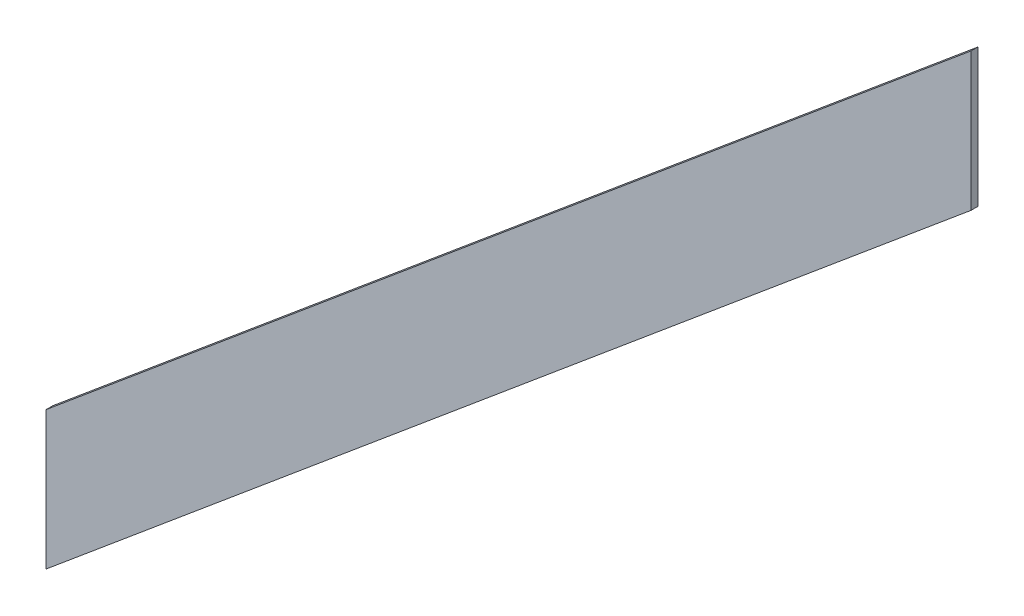
ISO-10303-21;
HEADER;
FILE_DESCRIPTION(('STEP AP214'),'2;1');
FILE_NAME('part.step','',(''),(''),'','','');
FILE_SCHEMA(('AUTOMOTIVE_DESIGN { 1 0 10303 214 1 1 1 1 }'));
ENDSEC;
DATA;
#1=APPLICATION_CONTEXT('core data for automotive mechanical design processes');
#2=APPLICATION_PROTOCOL_DEFINITION('international standard','automotive_design',2000,#1);
#3=PRODUCT_CONTEXT('',#1,'mechanical');
#4=PRODUCT('Part','Part','',(#3));
#5=PRODUCT_RELATED_PRODUCT_CATEGORY('part','',(#4));
#6=PRODUCT_DEFINITION_FORMATION('','',#4);
#7=PRODUCT_DEFINITION_CONTEXT('part definition',#1,'design');
#8=PRODUCT_DEFINITION('design','',#6,#7);
#9=PRODUCT_DEFINITION_SHAPE('','',#8);
#10=(LENGTH_UNIT() NAMED_UNIT(*) SI_UNIT(.MILLI.,.METRE.));
#11=(NAMED_UNIT(*) PLANE_ANGLE_UNIT() SI_UNIT($,.RADIAN.));
#12=(NAMED_UNIT(*) SI_UNIT($,.STERADIAN.) SOLID_ANGLE_UNIT());
#13=UNCERTAINTY_MEASURE_WITH_UNIT(LENGTH_MEASURE(1.E-05),#10,'distance_accuracy_value','');
#14=(GEOMETRIC_REPRESENTATION_CONTEXT(3) GLOBAL_UNCERTAINTY_ASSIGNED_CONTEXT((#13)) GLOBAL_UNIT_ASSIGNED_CONTEXT((#10,
#11,#12)) REPRESENTATION_CONTEXT('',''));
#15=CARTESIAN_POINT('',(0.,0.,0.));
#16=DIRECTION('',(0.,0.,1.));
#17=DIRECTION('',(1.,0.,0.));
#18=AXIS2_PLACEMENT_3D('',#15,#16,#17);
#19=CARTESIAN_POINT('',(3.54662453204845,-4.24328292227225,5.));
#20=DIRECTION('',(-0.641310134431533,0.767281767980583,0.));
#21=DIRECTION('',(-0.767281767980583,-0.641310134431533,0.));
#22=AXIS2_PLACEMENT_3D('',#19,#20,#21);
#23=PLANE('',#22);
#24=DIRECTION('',(0.767281767980583,0.641310134431533,0.));
#25=VECTOR('',#24,1.);
#26=CARTESIAN_POINT('',(3.54662453204845,-4.24328292227225,0.));
#27=LINE('',#26,#25);
#28=CARTESIAN_POINT('',(-310.633143495237,-266.841297989854,0.));
#29=VERTEX_POINT('',#28);
#30=CARTESIAN_POINT('',(359.366856504763,293.158702010146,0.));
#31=VERTEX_POINT('',#30);
#32=EDGE_CURVE('E98',#29,#31,#27,.T.);
#33=ORIENTED_EDGE('',*,*,#32,.T.);
#34=DIRECTION('',(0.,0.,-1.));
#35=VECTOR('',#34,1.);
#36=CARTESIAN_POINT('',(359.366856504763,293.158702010146,5.));
#37=LINE('',#36,#35);
#38=CARTESIAN_POINT('',(359.366856504763,293.158702010146,5.));
#39=VERTEX_POINT('',#38);
#40=EDGE_CURVE('E11',#39,#31,#37,.T.);
#41=ORIENTED_EDGE('',*,*,#40,.F.);
#42=DIRECTION('',(0.767281767980583,0.641310134431533,0.));
#43=VECTOR('',#42,1.);
#44=CARTESIAN_POINT('',(3.54662453204845,-4.24328292227225,5.));
#45=LINE('',#44,#43);
#46=CARTESIAN_POINT('',(-310.633143495237,-266.841297989854,5.));
#47=VERTEX_POINT('',#46);
#48=EDGE_CURVE('E84',#47,#39,#45,.T.);
#49=ORIENTED_EDGE('',*,*,#48,.F.);
#50=DIRECTION('',(0.,0.,-1.));
#51=VECTOR('',#50,1.);
#52=CARTESIAN_POINT('',(-310.633143495237,-266.841297989854,5.));
#53=LINE('',#52,#51);
#54=EDGE_CURVE('E51',#47,#29,#53,.T.);
#55=ORIENTED_EDGE('',*,*,#54,.T.);
#56=EDGE_LOOP('',(#33,#41,#49,#55));
#57=FACE_BOUND('',#56,.T.);
#58=ADVANCED_FACE('F35',(#57),#23,.F.);
#59=CARTESIAN_POINT('',(359.366856504763,0.,5.));
#60=DIRECTION('',(-1.,0.,0.));
#61=DIRECTION('',(0.,0.,1.));
#62=AXIS2_PLACEMENT_3D('',#59,#60,#61);
#63=PLANE('',#62);
#64=DIRECTION('',(0.,1.,0.));
#65=VECTOR('',#64,1.);
#66=CARTESIAN_POINT('',(359.366856504763,0.,0.));
#67=LINE('',#66,#65);
#68=CARTESIAN_POINT('',(359.366856504763,393.158702010146,0.));
#69=VERTEX_POINT('',#68);
#70=EDGE_CURVE('E89',#31,#69,#67,.T.);
#71=ORIENTED_EDGE('',*,*,#70,.T.);
#72=DIRECTION('',(0.,0.,-1.));
#73=VECTOR('',#72,1.);
#74=CARTESIAN_POINT('',(359.366856504763,393.158702010146,5.));
#75=LINE('',#74,#73);
#76=CARTESIAN_POINT('',(359.366856504763,393.158702010146,5.));
#77=VERTEX_POINT('',#76);
#78=EDGE_CURVE('E43',#77,#69,#75,.T.);
#79=ORIENTED_EDGE('',*,*,#78,.F.);
#80=DIRECTION('',(0.,1.,0.));
#81=VECTOR('',#80,1.);
#82=CARTESIAN_POINT('',(359.366856504763,0.,5.));
#83=LINE('',#82,#81);
#84=EDGE_CURVE('E77',#39,#77,#83,.T.);
#85=ORIENTED_EDGE('',*,*,#84,.F.);
#86=ORIENTED_EDGE('',*,*,#40,.T.);
#87=EDGE_LOOP('',(#71,#79,#85,#86));
#88=FACE_BOUND('',#87,.T.);
#89=ADVANCED_FACE('F88',(#88),#63,.F.);
#90=CARTESIAN_POINT('',(-45.6599328450007,54.6288482252686,5.));
#91=DIRECTION('',(0.641310134431533,-0.767281767980583,0.));
#92=DIRECTION('',(0.767281767980583,0.641310134431533,0.));
#93=AXIS2_PLACEMENT_3D('',#90,#91,#92);
#94=PLANE('',#93);
#95=DIRECTION('',(-0.767281767980583,-0.641310134431533,0.));
#96=VECTOR('',#95,1.);
#97=CARTESIAN_POINT('',(-45.6599328450007,54.6288482252686,0.));
#98=LINE('',#97,#96);
#99=CARTESIAN_POINT('',(-310.633143495237,-166.841297989854,0.));
#100=VERTEX_POINT('',#99);
#101=EDGE_CURVE('E101',#69,#100,#98,.T.);
#102=ORIENTED_EDGE('',*,*,#101,.T.);
#103=DIRECTION('',(0.,0.,-1.));
#104=VECTOR('',#103,1.);
#105=CARTESIAN_POINT('',(-310.633143495237,-166.841297989854,5.));
#106=LINE('',#105,#104);
#107=CARTESIAN_POINT('',(-310.633143495237,-166.841297989854,5.));
#108=VERTEX_POINT('',#107);
#109=EDGE_CURVE('E66',#108,#100,#106,.T.);
#110=ORIENTED_EDGE('',*,*,#109,.F.);
#111=DIRECTION('',(-0.767281767980583,-0.641310134431533,0.));
#112=VECTOR('',#111,1.);
#113=CARTESIAN_POINT('',(-45.6599328450007,54.6288482252686,5.));
#114=LINE('',#113,#112);
#115=EDGE_CURVE('E83',#77,#108,#114,.T.);
#116=ORIENTED_EDGE('',*,*,#115,.F.);
#117=ORIENTED_EDGE('',*,*,#78,.T.);
#118=EDGE_LOOP('',(#102,#110,#116,#117));
#119=FACE_BOUND('',#118,.T.);
#120=ADVANCED_FACE('F92',(#119),#94,.F.);
#121=CARTESIAN_POINT('',(-310.633143495237,0.,5.));
#122=DIRECTION('',(-1.,0.,0.));
#123=DIRECTION('',(0.,0.,1.));
#124=AXIS2_PLACEMENT_3D('',#121,#122,#123);
#125=PLANE('',#124);
#126=DIRECTION('',(0.,1.,0.));
#127=VECTOR('',#126,1.);
#128=CARTESIAN_POINT('',(-310.633143495237,0.,0.));
#129=LINE('',#128,#127);
#130=EDGE_CURVE('E103',#29,#100,#129,.T.);
#131=ORIENTED_EDGE('',*,*,#130,.F.);
#132=ORIENTED_EDGE('',*,*,#54,.F.);
#133=DIRECTION('',(0.,1.,0.));
#134=VECTOR('',#133,1.);
#135=CARTESIAN_POINT('',(-310.633143495237,0.,5.));
#136=LINE('',#135,#134);
#137=EDGE_CURVE('E93',#47,#108,#136,.T.);
#138=ORIENTED_EDGE('',*,*,#137,.T.);
#139=ORIENTED_EDGE('',*,*,#109,.T.);
#140=EDGE_LOOP('',(#131,#132,#138,#139));
#141=FACE_BOUND('',#140,.T.);
#142=ADVANCED_FACE('F109',(#141),#125,.T.);
#143=CARTESIAN_POINT('',(0.,0.,5.));
#144=DIRECTION('',(0.,0.,1.));
#145=DIRECTION('',(1.,0.,0.));
#146=AXIS2_PLACEMENT_3D('',#143,#144,#145);
#147=PLANE('',#146);
#148=ORIENTED_EDGE('',*,*,#48,.T.);
#149=ORIENTED_EDGE('',*,*,#84,.T.);
#150=ORIENTED_EDGE('',*,*,#115,.T.);
#151=ORIENTED_EDGE('',*,*,#137,.F.);
#152=EDGE_LOOP('',(#148,#149,#150,#151));
#153=FACE_BOUND('',#152,.T.);
#154=ADVANCED_FACE('F80',(#153),#147,.T.);
#155=CARTESIAN_POINT('',(0.,0.,0.));
#156=DIRECTION('',(0.,0.,1.));
#157=DIRECTION('',(1.,0.,0.));
#158=AXIS2_PLACEMENT_3D('',#155,#156,#157);
#159=PLANE('',#158);
#160=ORIENTED_EDGE('',*,*,#32,.F.);
#161=ORIENTED_EDGE('',*,*,#130,.T.);
#162=ORIENTED_EDGE('',*,*,#101,.F.);
#163=ORIENTED_EDGE('',*,*,#70,.F.);
#164=EDGE_LOOP('',(#160,#161,#162,#163));
#165=FACE_BOUND('',#164,.T.);
#166=ADVANCED_FACE('F108',(#165),#159,.F.);
#167=CLOSED_SHELL('',(#58,#89,#120,#142,#154,#166));
#168=MANIFOLD_SOLID_BREP('B2',#167);
#169=ADVANCED_BREP_SHAPE_REPRESENTATION('',(#18,#168),#14);
#170=SHAPE_DEFINITION_REPRESENTATION(#9,#169);
ENDSEC;
END-ISO-10303-21;
